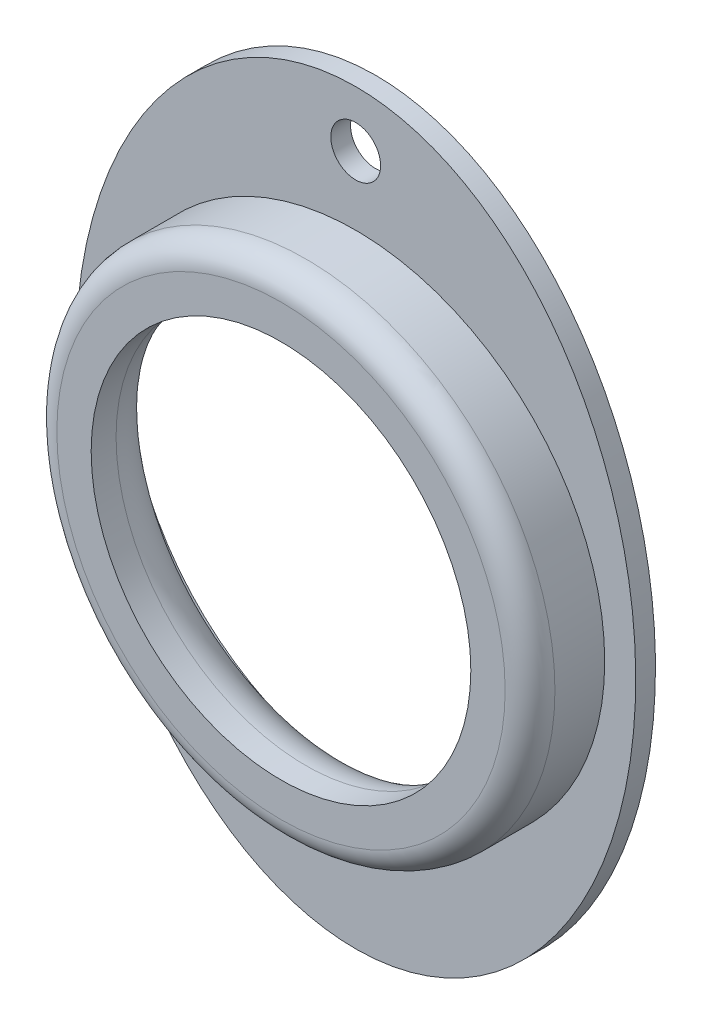
ISO-10303-21;
HEADER;
FILE_DESCRIPTION(('STEP AP214'),'2;1');
FILE_NAME('part.step','',(''),(''),'','','');
FILE_SCHEMA(('AUTOMOTIVE_DESIGN { 1 0 10303 214 1 1 1 1 }'));
ENDSEC;
DATA;
#1=APPLICATION_CONTEXT('core data for automotive mechanical design processes');
#2=APPLICATION_PROTOCOL_DEFINITION('international standard','automotive_design',2000,#1);
#3=PRODUCT_CONTEXT('',#1,'mechanical');
#4=PRODUCT('Part','Part','',(#3));
#5=PRODUCT_RELATED_PRODUCT_CATEGORY('part','',(#4));
#6=PRODUCT_DEFINITION_FORMATION('','',#4);
#7=PRODUCT_DEFINITION_CONTEXT('part definition',#1,'design');
#8=PRODUCT_DEFINITION('design','',#6,#7);
#9=PRODUCT_DEFINITION_SHAPE('','',#8);
#10=(LENGTH_UNIT() NAMED_UNIT(*) SI_UNIT(.MILLI.,.METRE.));
#11=(NAMED_UNIT(*) PLANE_ANGLE_UNIT() SI_UNIT($,.RADIAN.));
#12=(NAMED_UNIT(*) SI_UNIT($,.STERADIAN.) SOLID_ANGLE_UNIT());
#13=UNCERTAINTY_MEASURE_WITH_UNIT(LENGTH_MEASURE(1.E-05),#10,'distance_accuracy_value','');
#14=(GEOMETRIC_REPRESENTATION_CONTEXT(3) GLOBAL_UNCERTAINTY_ASSIGNED_CONTEXT((#13)) GLOBAL_UNIT_ASSIGNED_CONTEXT((#10,
#11,#12)) REPRESENTATION_CONTEXT('',''));
#15=CARTESIAN_POINT('',(0.,0.,0.));
#16=DIRECTION('',(0.,0.,1.));
#17=DIRECTION('',(1.,0.,0.));
#18=AXIS2_PLACEMENT_3D('',#15,#16,#17);
#19=CARTESIAN_POINT('',(0.,0.,6.));
#20=DIRECTION('',(0.,0.,-1.));
#21=DIRECTION('',(-1.,0.,0.));
#22=AXIS2_PLACEMENT_3D('',#19,#20,#21);
#23=CYLINDRICAL_SURFACE('',#22,15.2509872204812);
#24=CARTESIAN_POINT('',(0.,0.,4.));
#25=DIRECTION('',(0.,0.,1.));
#26=DIRECTION('',(1.,0.,0.));
#27=AXIS2_PLACEMENT_3D('',#24,#25,#26);
#28=CIRCLE('',#27,15.2509872204812);
#29=CARTESIAN_POINT('',(15.2509872204812,0.,4.));
#30=VERTEX_POINT('',#29);
#31=EDGE_CURVE('E63',#30,#30,#28,.F.);
#32=ORIENTED_EDGE('',*,*,#31,.T.);
#33=EDGE_LOOP('',(#32));
#34=FACE_BOUND('',#33,.T.);
#35=CARTESIAN_POINT('',(0.,0.,6.));
#36=DIRECTION('',(0.,0.,1.));
#37=DIRECTION('',(1.,0.,0.));
#38=AXIS2_PLACEMENT_3D('',#35,#36,#37);
#39=CIRCLE('',#38,15.2509872204812);
#40=CARTESIAN_POINT('',(15.2509872204812,0.,6.));
#41=VERTEX_POINT('',#40);
#42=EDGE_CURVE('E74',#41,#41,#39,.T.);
#43=ORIENTED_EDGE('',*,*,#42,.T.);
#44=EDGE_LOOP('',(#43));
#45=FACE_BOUND('',#44,.T.);
#46=ADVANCED_FACE('F50',(#34,#45),#23,.F.);
#47=CARTESIAN_POINT('',(0.,0.,6.));
#48=DIRECTION('',(0.,0.,-1.));
#49=DIRECTION('',(-1.,0.,0.));
#50=AXIS2_PLACEMENT_3D('',#47,#48,#49);
#51=CYLINDRICAL_SURFACE('',#50,20.0083112986119);
#52=CARTESIAN_POINT('',(0.,0.,4.));
#53=DIRECTION('',(0.,0.,1.));
#54=DIRECTION('',(1.,0.,0.));
#55=AXIS2_PLACEMENT_3D('',#52,#53,#54);
#56=CIRCLE('',#55,20.0083112986119);
#57=CARTESIAN_POINT('',(20.0083112986119,0.,4.));
#58=VERTEX_POINT('',#57);
#59=EDGE_CURVE('E11',#58,#58,#56,.F.);
#60=ORIENTED_EDGE('',*,*,#59,.T.);
#61=EDGE_LOOP('',(#60));
#62=FACE_BOUND('',#61,.T.);
#63=CARTESIAN_POINT('',(0.,0.,0.));
#64=DIRECTION('',(0.,0.,1.));
#65=DIRECTION('',(1.,0.,0.));
#66=AXIS2_PLACEMENT_3D('',#63,#64,#65);
#67=CIRCLE('',#66,20.0083112986119);
#68=CARTESIAN_POINT('',(20.0083112986119,0.,0.));
#69=VERTEX_POINT('',#68);
#70=EDGE_CURVE('E75',#69,#69,#67,.T.);
#71=ORIENTED_EDGE('',*,*,#70,.T.);
#72=EDGE_LOOP('',(#71));
#73=FACE_BOUND('',#72,.T.);
#74=ADVANCED_FACE('F87',(#62,#73),#51,.T.);
#75=CARTESIAN_POINT('',(0.,0.,6.));
#76=DIRECTION('',(0.,0.,1.));
#77=DIRECTION('',(1.,0.,0.));
#78=AXIS2_PLACEMENT_3D('',#75,#76,#77);
#79=PLANE('',#78);
#80=CARTESIAN_POINT('',(0.,0.,6.));
#81=DIRECTION('',(0.,0.,1.));
#82=DIRECTION('',(1.,0.,0.));
#83=AXIS2_PLACEMENT_3D('',#80,#81,#82);
#84=CIRCLE('',#83,18.0083112986119);
#85=CARTESIAN_POINT('',(18.0083112986119,0.,6.));
#86=VERTEX_POINT('',#85);
#87=EDGE_CURVE('E58',#86,#86,#84,.T.);
#88=ORIENTED_EDGE('',*,*,#87,.T.);
#89=EDGE_LOOP('',(#88));
#90=FACE_BOUND('',#89,.T.);
#91=ORIENTED_EDGE('',*,*,#42,.F.);
#92=EDGE_LOOP('',(#91));
#93=FACE_BOUND('',#92,.T.);
#94=ADVANCED_FACE('F84',(#90,#93),#79,.T.);
#95=CARTESIAN_POINT('',(0.,0.,0.));
#96=DIRECTION('',(0.,0.,1.));
#97=DIRECTION('',(1.,0.,0.));
#98=AXIS2_PLACEMENT_3D('',#95,#96,#97);
#99=PLANE('',#98);
#100=CARTESIAN_POINT('',(0.,0.,0.));
#101=DIRECTION('',(0.,0.,1.));
#102=DIRECTION('',(1.,0.,0.));
#103=AXIS2_PLACEMENT_3D('',#100,#101,#102);
#104=CIRCLE('',#103,19.2509872204812);
#105=CARTESIAN_POINT('',(19.2509872204812,0.,0.));
#106=VERTEX_POINT('',#105);
#107=EDGE_CURVE('E68',#106,#106,#104,.T.);
#108=ORIENTED_EDGE('',*,*,#107,.T.);
#109=EDGE_LOOP('',(#108));
#110=FACE_BOUND('',#109,.T.);
#111=ORIENTED_EDGE('',*,*,#70,.F.);
#112=EDGE_LOOP('',(#111));
#113=FACE_BOUND('',#112,.T.);
#114=ADVANCED_FACE('F86',(#110,#113),#99,.F.);
#115=CARTESIAN_POINT('',(0.,0.,4.));
#116=DIRECTION('',(0.,0.,1.));
#117=DIRECTION('',(1.,0.,0.));
#118=AXIS2_PLACEMENT_3D('',#115,#116,#117);
#119=TOROIDAL_SURFACE('',#118,19.2509872204812,4.);
#120=ORIENTED_EDGE('',*,*,#31,.F.);
#121=EDGE_LOOP('',(#120));
#122=FACE_BOUND('',#121,.T.);
#123=ORIENTED_EDGE('',*,*,#107,.F.);
#124=EDGE_LOOP('',(#123));
#125=FACE_BOUND('',#124,.T.);
#126=ADVANCED_FACE('F93',(#122,#125),#119,.T.);
#127=CARTESIAN_POINT('',(0.,0.,4.));
#128=DIRECTION('',(0.,0.,1.));
#129=DIRECTION('',(1.,0.,0.));
#130=AXIS2_PLACEMENT_3D('',#127,#128,#129);
#131=TOROIDAL_SURFACE('',#130,18.0083112986119,2.);
#132=ORIENTED_EDGE('',*,*,#59,.F.);
#133=EDGE_LOOP('',(#132));
#134=FACE_BOUND('',#133,.T.);
#135=ORIENTED_EDGE('',*,*,#87,.F.);
#136=EDGE_LOOP('',(#135));
#137=FACE_BOUND('',#136,.T.);
#138=ADVANCED_FACE('F52',(#134,#137),#131,.T.);
#139=CLOSED_SHELL('',(#46,#74,#94,#114,#126,#138));
#140=MANIFOLD_SOLID_BREP('B2',#139);
#141=CARTESIAN_POINT('',(0.,0.,-1.5875));
#142=DIRECTION('',(0.,0.,1.));
#143=DIRECTION('',(1.,0.,0.));
#144=AXIS2_PLACEMENT_3D('',#141,#142,#143);
#145=CYLINDRICAL_SURFACE('',#144,20.0083112986119);
#146=CARTESIAN_POINT('',(0.,0.,-1.5875));
#147=DIRECTION('',(0.,0.,1.));
#148=DIRECTION('',(1.,0.,0.));
#149=AXIS2_PLACEMENT_3D('',#146,#147,#148);
#150=CIRCLE('',#149,20.0083112986119);
#151=CARTESIAN_POINT('',(20.0083112986119,0.,-1.5875));
#152=VERTEX_POINT('',#151);
#153=EDGE_CURVE('E166',#152,#152,#150,.T.);
#154=ORIENTED_EDGE('',*,*,#153,.F.);
#155=EDGE_LOOP('',(#154));
#156=FACE_BOUND('',#155,.T.);
#157=CARTESIAN_POINT('',(0.,0.,0.));
#158=DIRECTION('',(0.,0.,1.));
#159=DIRECTION('',(1.,0.,0.));
#160=AXIS2_PLACEMENT_3D('',#157,#158,#159);
#161=CIRCLE('',#160,20.0083112986119);
#162=CARTESIAN_POINT('',(20.0083112986119,0.,0.));
#163=VERTEX_POINT('',#162);
#164=EDGE_CURVE('E176',#163,#163,#161,.T.);
#165=ORIENTED_EDGE('',*,*,#164,.T.);
#166=EDGE_LOOP('',(#165));
#167=FACE_BOUND('',#166,.T.);
#168=ADVANCED_FACE('F159',(#156,#167),#145,.F.);
#169=CARTESIAN_POINT('',(0.,0.,-1.5875));
#170=DIRECTION('',(0.,0.,1.));
#171=DIRECTION('',(0.,1.,0.));
#172=AXIS2_PLACEMENT_3D('',#169,#170,#171);
#173=ELLIPSE('',#172,30.,22.5);
#174=DIRECTION('',(0.,0.,1.));
#175=VECTOR('',#174,1.);
#176=SURFACE_OF_LINEAR_EXTRUSION('',#173,#175);
#177=CARTESIAN_POINT('',(0.,30.,-1.5875));
#178=VERTEX_POINT('',#177);
#179=EDGE_CURVE('E49',#178,#178,#173,.T.);
#180=ORIENTED_EDGE('',*,*,#179,.T.);
#181=EDGE_LOOP('',(#180));
#182=FACE_BOUND('',#181,.T.);
#183=CARTESIAN_POINT('',(0.,0.,0.));
#184=DIRECTION('',(0.,0.,1.));
#185=DIRECTION('',(0.,1.,0.));
#186=AXIS2_PLACEMENT_3D('',#183,#184,#185);
#187=ELLIPSE('',#186,30.,22.5);
#188=CARTESIAN_POINT('',(0.,30.,0.));
#189=VERTEX_POINT('',#188);
#190=EDGE_CURVE('E171',#189,#189,#187,.T.);
#191=ORIENTED_EDGE('',*,*,#190,.F.);
#192=EDGE_LOOP('',(#191));
#193=FACE_BOUND('',#192,.T.);
#194=ADVANCED_FACE('F177',(#182,#193),#176,.T.);
#195=CARTESIAN_POINT('',(0.,0.,-1.5875));
#196=DIRECTION('',(0.,0.,1.));
#197=DIRECTION('',(1.,0.,0.));
#198=AXIS2_PLACEMENT_3D('',#195,#196,#197);
#199=PLANE('',#198);
#200=CARTESIAN_POINT('',(0.,25.5,-1.5875));
#201=DIRECTION('',(0.,0.,-1.));
#202=DIRECTION('',(-1.,0.,0.));
#203=AXIS2_PLACEMENT_3D('',#200,#201,#202);
#204=CIRCLE('',#203,2.);
#205=CARTESIAN_POINT('',(-2.,25.5,-1.5875));
#206=VERTEX_POINT('',#205);
#207=EDGE_CURVE('E205',#206,#206,#204,.T.);
#208=ORIENTED_EDGE('',*,*,#207,.F.);
#209=EDGE_LOOP('',(#208));
#210=FACE_BOUND('',#209,.T.);
#211=ORIENTED_EDGE('',*,*,#153,.T.);
#212=EDGE_LOOP('',(#211));
#213=FACE_BOUND('',#212,.T.);
#214=ORIENTED_EDGE('',*,*,#179,.F.);
#215=EDGE_LOOP('',(#214));
#216=FACE_BOUND('',#215,.T.);
#217=ADVANCED_FACE('F180',(#210,#213,#216),#199,.F.);
#218=CARTESIAN_POINT('',(0.,0.,0.));
#219=DIRECTION('',(0.,0.,1.));
#220=DIRECTION('',(1.,0.,0.));
#221=AXIS2_PLACEMENT_3D('',#218,#219,#220);
#222=PLANE('',#221);
#223=CARTESIAN_POINT('',(0.,25.5,0.));
#224=DIRECTION('',(0.,0.,1.));
#225=DIRECTION('',(1.,0.,0.));
#226=AXIS2_PLACEMENT_3D('',#223,#224,#225);
#227=CIRCLE('',#226,2.);
#228=CARTESIAN_POINT('',(2.,25.5,0.));
#229=VERTEX_POINT('',#228);
#230=EDGE_CURVE('E162',#229,#229,#227,.T.);
#231=ORIENTED_EDGE('',*,*,#230,.F.);
#232=EDGE_LOOP('',(#231));
#233=FACE_BOUND('',#232,.T.);
#234=ORIENTED_EDGE('',*,*,#164,.F.);
#235=EDGE_LOOP('',(#234));
#236=FACE_BOUND('',#235,.T.);
#237=ORIENTED_EDGE('',*,*,#190,.T.);
#238=EDGE_LOOP('',(#237));
#239=FACE_BOUND('',#238,.T.);
#240=ADVANCED_FACE('F181',(#233,#236,#239),#222,.T.);
#241=CARTESIAN_POINT('',(0.,25.5,6.));
#242=DIRECTION('',(0.,0.,-1.));
#243=DIRECTION('',(-1.,0.,0.));
#244=AXIS2_PLACEMENT_3D('',#241,#242,#243);
#245=CYLINDRICAL_SURFACE('',#244,2.);
#246=ORIENTED_EDGE('',*,*,#230,.T.);
#247=EDGE_LOOP('',(#246));
#248=FACE_BOUND('',#247,.T.);
#249=ORIENTED_EDGE('',*,*,#207,.T.);
#250=EDGE_LOOP('',(#249));
#251=FACE_BOUND('',#250,.T.);
#252=ADVANCED_FACE('F184',(#248,#251),#245,.F.);
#253=CLOSED_SHELL('',(#168,#194,#217,#240,#252));
#254=MANIFOLD_SOLID_BREP('B6',#253);
#255=ADVANCED_BREP_SHAPE_REPRESENTATION('',(#18,#140,#254),#14);
#256=SHAPE_DEFINITION_REPRESENTATION(#9,#255);
ENDSEC;
END-ISO-10303-21;
